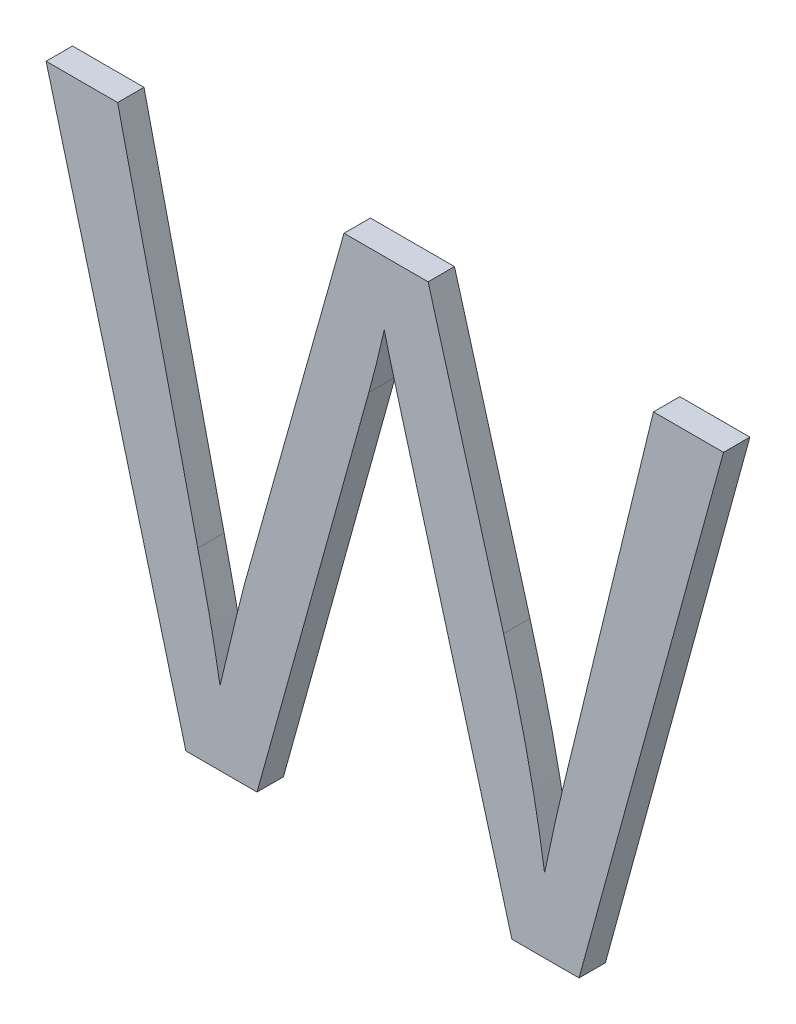
ISO-10303-21;
HEADER;
FILE_DESCRIPTION(('STEP AP214'),'2;1');
FILE_NAME('part.step','',(''),(''),'','','');
FILE_SCHEMA(('AUTOMOTIVE_DESIGN { 1 0 10303 214 1 1 1 1 }'));
ENDSEC;
DATA;
#1=APPLICATION_CONTEXT('core data for automotive mechanical design processes');
#2=APPLICATION_PROTOCOL_DEFINITION('international standard','automotive_design',2000,#1);
#3=PRODUCT_CONTEXT('',#1,'mechanical');
#4=PRODUCT('Part','Part','',(#3));
#5=PRODUCT_RELATED_PRODUCT_CATEGORY('part','',(#4));
#6=PRODUCT_DEFINITION_FORMATION('','',#4);
#7=PRODUCT_DEFINITION_CONTEXT('part definition',#1,'design');
#8=PRODUCT_DEFINITION('design','',#6,#7);
#9=PRODUCT_DEFINITION_SHAPE('','',#8);
#10=(LENGTH_UNIT() NAMED_UNIT(*) SI_UNIT(.MILLI.,.METRE.));
#11=(NAMED_UNIT(*) PLANE_ANGLE_UNIT() SI_UNIT($,.RADIAN.));
#12=(NAMED_UNIT(*) SI_UNIT($,.STERADIAN.) SOLID_ANGLE_UNIT());
#13=UNCERTAINTY_MEASURE_WITH_UNIT(LENGTH_MEASURE(1.E-05),#10,'distance_accuracy_value','');
#14=(GEOMETRIC_REPRESENTATION_CONTEXT(3) GLOBAL_UNCERTAINTY_ASSIGNED_CONTEXT((#13)) GLOBAL_UNIT_ASSIGNED_CONTEXT((#10,
#11,#12)) REPRESENTATION_CONTEXT('',''));
#15=CARTESIAN_POINT('',(0.,0.,0.));
#16=DIRECTION('',(0.,0.,1.));
#17=DIRECTION('',(1.,0.,0.));
#18=AXIS2_PLACEMENT_3D('',#15,#16,#17);
#19=CARTESIAN_POINT('',(3.803658458647,0.527411851963,0.05));
#20=DIRECTION('',(0.,0.,1.));
#21=DIRECTION('',(1.,0.,0.));
#22=AXIS2_PLACEMENT_3D('',#19,#20,#21);
#23=PLANE('',#22);
#24=DIRECTION('',(-0.256189417113928,0.966626599343731,0.));
#25=VECTOR('',#24,1.);
#26=CARTESIAN_POINT('',(3.427507267442,0.,0.05));
#27=LINE('',#26,#25);
#28=CARTESIAN_POINT('',(3.427507267442,0.,0.05));
#29=VERTEX_POINT('',#28);
#30=CARTESIAN_POINT('',(3.162472747093,1.,0.05));
#31=VERTEX_POINT('',#30);
#32=EDGE_CURVE('E251',#29,#31,#27,.T.);
#33=ORIENTED_EDGE('',*,*,#32,.F.);
#34=DIRECTION('',(-1.,0.,0.));
#35=VECTOR('',#34,1.);
#36=CARTESIAN_POINT('',(3.562409156977,0.,0.05));
#37=LINE('',#36,#35);
#38=CARTESIAN_POINT('',(3.562409156977,0.,0.05));
#39=VERTEX_POINT('',#38);
#40=EDGE_CURVE('E133',#39,#29,#37,.T.);
#41=ORIENTED_EDGE('',*,*,#40,.F.);
#42=DIRECTION('',(-0.267880789475975,-0.963452065558909,0.));
#43=VECTOR('',#42,1.);
#44=CARTESIAN_POINT('',(3.774300508721,0.762082122093,0.05));
#45=LINE('',#44,#43);
#46=CARTESIAN_POINT('',(3.774300508721,0.762082122093,0.05));
#47=VERTEX_POINT('',#46);
#48=EDGE_CURVE('E201',#47,#39,#45,.T.);
#49=ORIENTED_EDGE('',*,*,#48,.F.);
#50=CARTESIAN_POINT('',(3.803597383721,0.879405886628,0.05));
#51=CARTESIAN_POINT('',(3.787926962209,0.810501453488,0.05));
#52=CARTESIAN_POINT('',(3.774300508721,0.762082122093,0.05));
#53=(BOUNDED_CURVE() B_SPLINE_CURVE(2,(#50,#51,#52),.UNSPECIFIED.,.F.,
.F.) B_SPLINE_CURVE_WITH_KNOTS((3,3),(0.,1.),
.UNSPECIFIED.) CURVE() GEOMETRIC_REPRESENTATION_ITEM() RATIONAL_B_SPLINE_CURVE((1.,1.,1.)) REPRESENTATION_ITEM(''));
#54=CARTESIAN_POINT('',(3.803597383721,0.879405886628,0.05));
#55=VERTEX_POINT('',#54);
#56=EDGE_CURVE('E188',#55,#47,#53,.T.);
#57=ORIENTED_EDGE('',*,*,#56,.F.);
#58=CARTESIAN_POINT('',(3.834938226744,0.762082122093,0.05));
#59=CARTESIAN_POINT('',(3.808366642442,0.857558139535,0.05));
#60=CARTESIAN_POINT('',(3.803597383721,0.879405886628,0.05));
#61=(BOUNDED_CURVE() B_SPLINE_CURVE(2,(#58,#59,#60),.UNSPECIFIED.,.F.,
.F.) B_SPLINE_CURVE_WITH_KNOTS((3,3),(0.,1.),
.UNSPECIFIED.) CURVE() GEOMETRIC_REPRESENTATION_ITEM() RATIONAL_B_SPLINE_CURVE((1.,1.,1.)) REPRESENTATION_ITEM(''));
#62=CARTESIAN_POINT('',(3.834938226744,0.762082122093,0.05));
#63=VERTEX_POINT('',#62);
#64=EDGE_CURVE('E230',#63,#55,#61,.T.);
#65=ORIENTED_EDGE('',*,*,#64,.F.);
#66=DIRECTION('',(-0.266280599628952,0.963895555680825,0.));
#67=VECTOR('',#66,1.);
#68=CARTESIAN_POINT('',(4.04546693314,0.,0.05));
#69=LINE('',#68,#67);
#70=CARTESIAN_POINT('',(4.04546693314,0.,0.05));
#71=VERTEX_POINT('',#70);
#72=EDGE_CURVE('E237',#71,#63,#69,.T.);
#73=ORIENTED_EDGE('',*,*,#72,.F.);
#74=DIRECTION('',(-1.,0.,0.));
#75=VECTOR('',#74,1.);
#76=CARTESIAN_POINT('',(4.172874273256,0.,0.05));
#77=LINE('',#76,#75);
#78=CARTESIAN_POINT('',(4.172874273256,0.,0.05));
#79=VERTEX_POINT('',#78);
#80=EDGE_CURVE('E252',#79,#71,#77,.T.);
#81=ORIENTED_EDGE('',*,*,#80,.F.);
#82=DIRECTION('',(-0.264162578961926,-0.96447816557773,0.));
#83=VECTOR('',#82,1.);
#84=CARTESIAN_POINT('',(4.446765988372,1.,0.05));
#85=LINE('',#84,#83);
#86=CARTESIAN_POINT('',(4.446765988372,1.,0.05));
#87=VERTEX_POINT('',#86);
#88=EDGE_CURVE('E341',#87,#79,#85,.T.);
#89=ORIENTED_EDGE('',*,*,#88,.F.);
#90=DIRECTION('',(1.,0.,0.));
#91=VECTOR('',#90,1.);
#92=CARTESIAN_POINT('',(4.31390806686,1.,0.05));
#93=LINE('',#92,#91);
#94=CARTESIAN_POINT('',(4.31390806686,1.,0.05));
#95=VERTEX_POINT('',#94);
#96=EDGE_CURVE('E333',#95,#87,#93,.T.);
#97=ORIENTED_EDGE('',*,*,#96,.F.);
#98=DIRECTION('',(0.236892951176044,0.971535758314178,0.));
#99=VECTOR('',#98,1.);
#100=CARTESIAN_POINT('',(4.157203851744,0.357331031977,0.05));
#101=LINE('',#100,#99);
#102=CARTESIAN_POINT('',(4.157203851744,0.357331031977,0.05));
#103=VERTEX_POINT('',#102);
#104=EDGE_CURVE('E222',#103,#95,#101,.T.);
#105=ORIENTED_EDGE('',*,*,#104,.F.);
#106=CARTESIAN_POINT('',(4.107467296512,0.139671148256,0.05));
#107=CARTESIAN_POINT('',(4.126544331395,0.234511264535,0.05));
#108=CARTESIAN_POINT('',(4.157203851744,0.357331031977,0.05));
#109=(BOUNDED_CURVE() B_SPLINE_CURVE(2,(#106,#107,#108),.UNSPECIFIED.,.F.,
.F.) B_SPLINE_CURVE_WITH_KNOTS((3,3),(0.,1.),
.UNSPECIFIED.) CURVE() GEOMETRIC_REPRESENTATION_ITEM() RATIONAL_B_SPLINE_CURVE((1.,1.,1.)) REPRESENTATION_ITEM(''));
#110=CARTESIAN_POINT('',(4.107467296512,0.139671148256,0.05));
#111=VERTEX_POINT('',#110);
#112=EDGE_CURVE('E349',#111,#103,#109,.T.);
#113=ORIENTED_EDGE('',*,*,#112,.F.);
#114=CARTESIAN_POINT('',(4.029796511628,0.493777252907,0.05));
#115=CARTESIAN_POINT('',(4.083621002907,0.305459665698,0.05));
#116=CARTESIAN_POINT('',(4.107467296512,0.139671148256,0.05));
#117=(BOUNDED_CURVE() B_SPLINE_CURVE(2,(#114,#115,#116),.UNSPECIFIED.,.F.,
.F.) B_SPLINE_CURVE_WITH_KNOTS((3,3),(0.,1.),
.UNSPECIFIED.) CURVE() GEOMETRIC_REPRESENTATION_ITEM() RATIONAL_B_SPLINE_CURVE((1.,1.,1.)) REPRESENTATION_ITEM(''));
#118=CARTESIAN_POINT('',(4.029796511628,0.493777252907,0.05));
#119=VERTEX_POINT('',#118);
#120=EDGE_CURVE('E301',#119,#111,#117,.T.);
#121=ORIENTED_EDGE('',*,*,#120,.F.);
#122=DIRECTION('',(0.271983078318987,-0.962302034242954,0.));
#123=VECTOR('',#122,1.);
#124=CARTESIAN_POINT('',(3.88671875,1.,0.05));
#125=LINE('',#124,#123);
#126=CARTESIAN_POINT('',(3.88671875,1.,0.05));
#127=VERTEX_POINT('',#126);
#128=EDGE_CURVE('E362',#127,#119,#125,.T.);
#129=ORIENTED_EDGE('',*,*,#128,.F.);
#130=DIRECTION('',(1.,0.,0.));
#131=VECTOR('',#130,1.);
#132=CARTESIAN_POINT('',(3.727289244186,1.,0.05));
#133=LINE('',#132,#131);
#134=CARTESIAN_POINT('',(3.727289244186,1.,0.05));
#135=VERTEX_POINT('',#134);
#136=EDGE_CURVE('E294',#135,#127,#133,.T.);
#137=ORIENTED_EDGE('',*,*,#136,.F.);
#138=DIRECTION('',(0.270914292797929,0.962603472857748,0.));
#139=VECTOR('',#138,1.);
#140=CARTESIAN_POINT('',(3.537200218023,0.324582122093,0.05));
#141=LINE('',#140,#139);
#142=CARTESIAN_POINT('',(3.537200218023,0.324582122093,0.05));
#143=VERTEX_POINT('',#142);
#144=EDGE_CURVE('E271',#143,#135,#141,.T.);
#145=ORIENTED_EDGE('',*,*,#144,.F.);
#146=CARTESIAN_POINT('',(3.492232921512,0.139671148256,0.05));
#147=CARTESIAN_POINT('',(3.530386991279,0.300009084302,0.05));
#148=CARTESIAN_POINT('',(3.537200218023,0.324582122093,0.05));
#149=(BOUNDED_CURVE() B_SPLINE_CURVE(2,(#146,#147,#148),.UNSPECIFIED.,.F.,
.F.) B_SPLINE_CURVE_WITH_KNOTS((3,3),(0.,1.),
.UNSPECIFIED.) CURVE() GEOMETRIC_REPRESENTATION_ITEM() RATIONAL_B_SPLINE_CURVE((1.,1.,1.)) REPRESENTATION_ITEM(''));
#150=CARTESIAN_POINT('',(3.492232921512,0.139671148256,0.05));
#151=VERTEX_POINT('',#150);
#152=EDGE_CURVE('E355',#151,#143,#149,.T.);
#153=ORIENTED_EDGE('',*,*,#152,.F.);
#154=CARTESIAN_POINT('',(3.449990915698,0.344340479651,0.05));
#155=CARTESIAN_POINT('',(3.474518531977,0.241324491279,0.05));
#156=CARTESIAN_POINT('',(3.492232921512,0.139671148256,0.05));
#157=(BOUNDED_CURVE() B_SPLINE_CURVE(2,(#154,#155,#156),.UNSPECIFIED.,.F.,
.F.) B_SPLINE_CURVE_WITH_KNOTS((3,3),(0.,1.),
.UNSPECIFIED.) CURVE() GEOMETRIC_REPRESENTATION_ITEM() RATIONAL_B_SPLINE_CURVE((1.,1.,1.)) REPRESENTATION_ITEM(''));
#158=CARTESIAN_POINT('',(3.449990915698,0.344340479651,0.05));
#159=VERTEX_POINT('',#158);
#160=EDGE_CURVE('E282',#159,#151,#157,.T.);
#161=ORIENTED_EDGE('',*,*,#160,.F.);
#162=DIRECTION('',(0.225746612348977,-0.9741860535919,0.));
#163=VECTOR('',#162,1.);
#164=CARTESIAN_POINT('',(3.298055959302,1.,0.05));
#165=LINE('',#164,#163);
#166=CARTESIAN_POINT('',(3.298055959302,1.,0.05));
#167=VERTEX_POINT('',#166);
#168=EDGE_CURVE('E153',#167,#159,#165,.T.);
#169=ORIENTED_EDGE('',*,*,#168,.F.);
#170=DIRECTION('',(1.,0.,0.));
#171=VECTOR('',#170,1.);
#172=CARTESIAN_POINT('',(3.162472747093,1.,0.05));
#173=LINE('',#172,#171);
#174=EDGE_CURVE('E29',#31,#167,#173,.T.);
#175=ORIENTED_EDGE('',*,*,#174,.F.);
#176=EDGE_LOOP('',(#33,#41,#49,#57,#65,#73,#81,#89,#97,#105,#113,#121,#129,#137,#145,#153,#161,
#169,#175));
#177=FACE_BOUND('',#176,.T.);
#178=ADVANCED_FACE('F17',(#177),#23,.T.);
#179=CARTESIAN_POINT('',(3.803658458647,0.527411851963,0.));
#180=DIRECTION('',(0.,0.,1.));
#181=DIRECTION('',(1.,0.,0.));
#182=AXIS2_PLACEMENT_3D('',#179,#180,#181);
#183=PLANE('',#182);
#184=DIRECTION('',(1.,0.,0.));
#185=VECTOR('',#184,1.);
#186=CARTESIAN_POINT('',(3.162472747093,1.,0.));
#187=LINE('',#186,#185);
#188=CARTESIAN_POINT('',(3.162472747093,1.,0.));
#189=VERTEX_POINT('',#188);
#190=CARTESIAN_POINT('',(3.298055959302,1.,0.));
#191=VERTEX_POINT('',#190);
#192=EDGE_CURVE('E11',#189,#191,#187,.T.);
#193=ORIENTED_EDGE('',*,*,#192,.T.);
#194=DIRECTION('',(0.225746612348977,-0.9741860535919,0.));
#195=VECTOR('',#194,1.);
#196=CARTESIAN_POINT('',(3.298055959302,1.,0.));
#197=LINE('',#196,#195);
#198=CARTESIAN_POINT('',(3.449990915698,0.344340479651,0.));
#199=VERTEX_POINT('',#198);
#200=EDGE_CURVE('E22',#191,#199,#197,.T.);
#201=ORIENTED_EDGE('',*,*,#200,.T.);
#202=CARTESIAN_POINT('',(3.449990915698,0.344340479651,0.));
#203=CARTESIAN_POINT('',(3.474518531977,0.241324491279,0.));
#204=CARTESIAN_POINT('',(3.492232921512,0.139671148256,0.));
#205=(BOUNDED_CURVE() B_SPLINE_CURVE(2,(#202,#203,#204),.UNSPECIFIED.,.F.,
.F.) B_SPLINE_CURVE_WITH_KNOTS((3,3),(0.,1.),
.UNSPECIFIED.) CURVE() GEOMETRIC_REPRESENTATION_ITEM() RATIONAL_B_SPLINE_CURVE((1.,1.,1.)) REPRESENTATION_ITEM(''));
#206=CARTESIAN_POINT('',(3.492232921512,0.139671148256,0.));
#207=VERTEX_POINT('',#206);
#208=EDGE_CURVE('E277',#199,#207,#205,.T.);
#209=ORIENTED_EDGE('',*,*,#208,.T.);
#210=CARTESIAN_POINT('',(3.492232921512,0.139671148256,0.));
#211=CARTESIAN_POINT('',(3.530386991279,0.300009084302,0.));
#212=CARTESIAN_POINT('',(3.537200218023,0.324582122093,0.));
#213=(BOUNDED_CURVE() B_SPLINE_CURVE(2,(#210,#211,#212),.UNSPECIFIED.,.F.,
.F.) B_SPLINE_CURVE_WITH_KNOTS((3,3),(0.,1.),
.UNSPECIFIED.) CURVE() GEOMETRIC_REPRESENTATION_ITEM() RATIONAL_B_SPLINE_CURVE((1.,1.,1.)) REPRESENTATION_ITEM(''));
#214=CARTESIAN_POINT('',(3.537200218023,0.324582122093,0.));
#215=VERTEX_POINT('',#214);
#216=EDGE_CURVE('E331',#207,#215,#213,.T.);
#217=ORIENTED_EDGE('',*,*,#216,.T.);
#218=DIRECTION('',(0.270914292797929,0.962603472857748,0.));
#219=VECTOR('',#218,1.);
#220=CARTESIAN_POINT('',(3.537200218023,0.324582122093,0.));
#221=LINE('',#220,#219);
#222=CARTESIAN_POINT('',(3.727289244186,1.,0.));
#223=VERTEX_POINT('',#222);
#224=EDGE_CURVE('E264',#215,#223,#221,.T.);
#225=ORIENTED_EDGE('',*,*,#224,.T.);
#226=DIRECTION('',(1.,0.,0.));
#227=VECTOR('',#226,1.);
#228=CARTESIAN_POINT('',(3.727289244186,1.,0.));
#229=LINE('',#228,#227);
#230=CARTESIAN_POINT('',(3.88671875,1.,0.));
#231=VERTEX_POINT('',#230);
#232=EDGE_CURVE('E276',#223,#231,#229,.T.);
#233=ORIENTED_EDGE('',*,*,#232,.T.);
#234=DIRECTION('',(0.271983078318987,-0.962302034242954,0.));
#235=VECTOR('',#234,1.);
#236=CARTESIAN_POINT('',(3.88671875,1.,0.));
#237=LINE('',#236,#235);
#238=CARTESIAN_POINT('',(4.029796511628,0.493777252907,0.));
#239=VERTEX_POINT('',#238);
#240=EDGE_CURVE('E356',#231,#239,#237,.T.);
#241=ORIENTED_EDGE('',*,*,#240,.T.);
#242=CARTESIAN_POINT('',(4.029796511628,0.493777252907,0.));
#243=CARTESIAN_POINT('',(4.083621002907,0.305459665698,0.));
#244=CARTESIAN_POINT('',(4.107467296512,0.139671148256,0.));
#245=(BOUNDED_CURVE() B_SPLINE_CURVE(2,(#242,#243,#244),.UNSPECIFIED.,.F.,
.F.) B_SPLINE_CURVE_WITH_KNOTS((3,3),(0.,1.),
.UNSPECIFIED.) CURVE() GEOMETRIC_REPRESENTATION_ITEM() RATIONAL_B_SPLINE_CURVE((1.,1.,1.)) REPRESENTATION_ITEM(''));
#246=CARTESIAN_POINT('',(4.107467296512,0.139671148256,0.));
#247=VERTEX_POINT('',#246);
#248=EDGE_CURVE('E307',#239,#247,#245,.T.);
#249=ORIENTED_EDGE('',*,*,#248,.T.);
#250=CARTESIAN_POINT('',(4.107467296512,0.139671148256,0.));
#251=CARTESIAN_POINT('',(4.126544331395,0.234511264535,0.));
#252=CARTESIAN_POINT('',(4.157203851744,0.357331031977,0.));
#253=(BOUNDED_CURVE() B_SPLINE_CURVE(2,(#250,#251,#252),.UNSPECIFIED.,.F.,
.F.) B_SPLINE_CURVE_WITH_KNOTS((3,3),(0.,1.),
.UNSPECIFIED.) CURVE() GEOMETRIC_REPRESENTATION_ITEM() RATIONAL_B_SPLINE_CURVE((1.,1.,1.)) REPRESENTATION_ITEM(''));
#254=CARTESIAN_POINT('',(4.157203851744,0.357331031977,0.));
#255=VERTEX_POINT('',#254);
#256=EDGE_CURVE('E378',#247,#255,#253,.T.);
#257=ORIENTED_EDGE('',*,*,#256,.T.);
#258=DIRECTION('',(0.236892951176044,0.971535758314178,0.));
#259=VECTOR('',#258,1.);
#260=CARTESIAN_POINT('',(4.157203851744,0.357331031977,0.));
#261=LINE('',#260,#259);
#262=CARTESIAN_POINT('',(4.31390806686,1.,0.));
#263=VERTEX_POINT('',#262);
#264=EDGE_CURVE('E238',#255,#263,#261,.T.);
#265=ORIENTED_EDGE('',*,*,#264,.T.);
#266=DIRECTION('',(1.,0.,0.));
#267=VECTOR('',#266,1.);
#268=CARTESIAN_POINT('',(4.31390806686,1.,0.));
#269=LINE('',#268,#267);
#270=CARTESIAN_POINT('',(4.446765988372,1.,0.));
#271=VERTEX_POINT('',#270);
#272=EDGE_CURVE('E223',#263,#271,#269,.T.);
#273=ORIENTED_EDGE('',*,*,#272,.T.);
#274=DIRECTION('',(-0.264162578961926,-0.96447816557773,0.));
#275=VECTOR('',#274,1.);
#276=CARTESIAN_POINT('',(4.446765988372,1.,0.));
#277=LINE('',#276,#275);
#278=CARTESIAN_POINT('',(4.172874273256,0.,0.));
#279=VERTEX_POINT('',#278);
#280=EDGE_CURVE('E337',#271,#279,#277,.T.);
#281=ORIENTED_EDGE('',*,*,#280,.T.);
#282=DIRECTION('',(-1.,0.,0.));
#283=VECTOR('',#282,1.);
#284=CARTESIAN_POINT('',(4.172874273256,0.,0.));
#285=LINE('',#284,#283);
#286=CARTESIAN_POINT('',(4.04546693314,0.,0.));
#287=VERTEX_POINT('',#286);
#288=EDGE_CURVE('E255',#279,#287,#285,.T.);
#289=ORIENTED_EDGE('',*,*,#288,.T.);
#290=DIRECTION('',(-0.266280599628952,0.963895555680825,0.));
#291=VECTOR('',#290,1.);
#292=CARTESIAN_POINT('',(4.04546693314,0.,0.));
#293=LINE('',#292,#291);
#294=CARTESIAN_POINT('',(3.834938226744,0.762082122093,0.));
#295=VERTEX_POINT('',#294);
#296=EDGE_CURVE('E243',#287,#295,#293,.T.);
#297=ORIENTED_EDGE('',*,*,#296,.T.);
#298=CARTESIAN_POINT('',(3.834938226744,0.762082122093,0.));
#299=CARTESIAN_POINT('',(3.808366642442,0.857558139535,0.));
#300=CARTESIAN_POINT('',(3.803597383721,0.879405886628,0.));
#301=(BOUNDED_CURVE() B_SPLINE_CURVE(2,(#298,#299,#300),.UNSPECIFIED.,.F.,
.F.) B_SPLINE_CURVE_WITH_KNOTS((3,3),(0.,1.),
.UNSPECIFIED.) CURVE() GEOMETRIC_REPRESENTATION_ITEM() RATIONAL_B_SPLINE_CURVE((1.,1.,1.)) REPRESENTATION_ITEM(''));
#302=CARTESIAN_POINT('',(3.803597383721,0.879405886628,0.));
#303=VERTEX_POINT('',#302);
#304=EDGE_CURVE('E224',#295,#303,#301,.T.);
#305=ORIENTED_EDGE('',*,*,#304,.T.);
#306=CARTESIAN_POINT('',(3.803597383721,0.879405886628,0.));
#307=CARTESIAN_POINT('',(3.787926962209,0.810501453488,0.));
#308=CARTESIAN_POINT('',(3.774300508721,0.762082122093,0.));
#309=(BOUNDED_CURVE() B_SPLINE_CURVE(2,(#306,#307,#308),.UNSPECIFIED.,.F.,
.F.) B_SPLINE_CURVE_WITH_KNOTS((3,3),(0.,1.),
.UNSPECIFIED.) CURVE() GEOMETRIC_REPRESENTATION_ITEM() RATIONAL_B_SPLINE_CURVE((1.,1.,1.)) REPRESENTATION_ITEM(''));
#310=CARTESIAN_POINT('',(3.774300508721,0.762082122093,0.));
#311=VERTEX_POINT('',#310);
#312=EDGE_CURVE('E198',#303,#311,#309,.T.);
#313=ORIENTED_EDGE('',*,*,#312,.T.);
#314=DIRECTION('',(-0.267880789475975,-0.963452065558909,0.));
#315=VECTOR('',#314,1.);
#316=CARTESIAN_POINT('',(3.774300508721,0.762082122093,0.));
#317=LINE('',#316,#315);
#318=CARTESIAN_POINT('',(3.562409156977,0.,0.));
#319=VERTEX_POINT('',#318);
#320=EDGE_CURVE('E205',#311,#319,#317,.T.);
#321=ORIENTED_EDGE('',*,*,#320,.T.);
#322=DIRECTION('',(-1.,0.,0.));
#323=VECTOR('',#322,1.);
#324=CARTESIAN_POINT('',(3.562409156977,0.,0.));
#325=LINE('',#324,#323);
#326=CARTESIAN_POINT('',(3.427507267442,0.,0.));
#327=VERTEX_POINT('',#326);
#328=EDGE_CURVE('E120',#319,#327,#325,.T.);
#329=ORIENTED_EDGE('',*,*,#328,.T.);
#330=DIRECTION('',(-0.256189417113928,0.966626599343731,0.));
#331=VECTOR('',#330,1.);
#332=CARTESIAN_POINT('',(3.427507267442,0.,0.));
#333=LINE('',#332,#331);
#334=EDGE_CURVE('E250',#327,#189,#333,.T.);
#335=ORIENTED_EDGE('',*,*,#334,.T.);
#336=EDGE_LOOP('',(#193,#201,#209,#217,#225,#233,#241,#249,#257,#265,#273,#281,#289,#297,#305,
#313,#321,#329,#335));
#337=FACE_BOUND('',#336,.T.);
#338=ADVANCED_FACE('F494',(#337),#183,.F.);
#339=CARTESIAN_POINT('',(3.162472747093,1.,0.));
#340=DIRECTION('',(0.,1.,0.));
#341=DIRECTION('',(1.,0.,0.));
#342=AXIS2_PLACEMENT_3D('',#339,#340,#341);
#343=PLANE('',#342);
#344=DIRECTION('',(0.,0.,1.));
#345=VECTOR('',#344,1.);
#346=CARTESIAN_POINT('',(3.162472747093,1.,0.));
#347=LINE('',#346,#345);
#348=EDGE_CURVE('E247',#189,#31,#347,.T.);
#349=ORIENTED_EDGE('',*,*,#348,.T.);
#350=ORIENTED_EDGE('',*,*,#174,.T.);
#351=DIRECTION('',(0.,0.,1.));
#352=VECTOR('',#351,1.);
#353=CARTESIAN_POINT('',(3.298055959302,1.,0.));
#354=LINE('',#353,#352);
#355=EDGE_CURVE('E281',#191,#167,#354,.T.);
#356=ORIENTED_EDGE('',*,*,#355,.F.);
#357=ORIENTED_EDGE('',*,*,#192,.F.);
#358=EDGE_LOOP('',(#349,#350,#356,#357));
#359=FACE_BOUND('',#358,.T.);
#360=ADVANCED_FACE('F499',(#359),#343,.T.);
#361=CARTESIAN_POINT('',(3.298055959302,1.,0.));
#362=DIRECTION('',(0.9741860535919,0.225746612348977,0.));
#363=DIRECTION('',(0.,0.,-1.));
#364=AXIS2_PLACEMENT_3D('',#361,#362,#363);
#365=PLANE('',#364);
#366=ORIENTED_EDGE('',*,*,#355,.T.);
#367=ORIENTED_EDGE('',*,*,#168,.T.);
#368=DIRECTION('',(0.,0.,1.));
#369=VECTOR('',#368,1.);
#370=CARTESIAN_POINT('',(3.449990915698,0.344340479651,0.));
#371=LINE('',#370,#369);
#372=EDGE_CURVE('E328',#199,#159,#371,.T.);
#373=ORIENTED_EDGE('',*,*,#372,.F.);
#374=ORIENTED_EDGE('',*,*,#200,.F.);
#375=EDGE_LOOP('',(#366,#367,#373,#374));
#376=FACE_BOUND('',#375,.T.);
#377=ADVANCED_FACE('F490',(#376),#365,.T.);
#378=CARTESIAN_POINT('',(3.449990915698,0.344340479651,0.));
#379=CARTESIAN_POINT('',(3.474518531977,0.241324491279,0.));
#380=CARTESIAN_POINT('',(3.492232921512,0.139671148256,0.));
#381=(BOUNDED_CURVE() B_SPLINE_CURVE(2,(#378,#379,#380),.UNSPECIFIED.,.F.,
.F.) B_SPLINE_CURVE_WITH_KNOTS((3,3),(0.,1.),
.UNSPECIFIED.) CURVE() GEOMETRIC_REPRESENTATION_ITEM() RATIONAL_B_SPLINE_CURVE((1.,1.,1.)) REPRESENTATION_ITEM(''));
#382=DIRECTION('',(0.,0.,-1.));
#383=VECTOR('',#382,1.);
#384=SURFACE_OF_LINEAR_EXTRUSION('',#381,#383);
#385=ORIENTED_EDGE('',*,*,#372,.T.);
#386=ORIENTED_EDGE('',*,*,#160,.T.);
#387=DIRECTION('',(0.,0.,1.));
#388=VECTOR('',#387,1.);
#389=CARTESIAN_POINT('',(3.492232921512,0.139671148256,0.));
#390=LINE('',#389,#388);
#391=EDGE_CURVE('E218',#207,#151,#390,.T.);
#392=ORIENTED_EDGE('',*,*,#391,.F.);
#393=ORIENTED_EDGE('',*,*,#208,.F.);
#394=EDGE_LOOP('',(#385,#386,#392,#393));
#395=FACE_BOUND('',#394,.T.);
#396=ADVANCED_FACE('F486',(#395),#384,.T.);
#397=CARTESIAN_POINT('',(3.492232921512,0.139671148256,0.));
#398=CARTESIAN_POINT('',(3.530386991279,0.300009084302,0.));
#399=CARTESIAN_POINT('',(3.537200218023,0.324582122093,0.));
#400=(BOUNDED_CURVE() B_SPLINE_CURVE(2,(#397,#398,#399),.UNSPECIFIED.,.F.,
.F.) B_SPLINE_CURVE_WITH_KNOTS((3,3),(0.,1.),
.UNSPECIFIED.) CURVE() GEOMETRIC_REPRESENTATION_ITEM() RATIONAL_B_SPLINE_CURVE((1.,1.,1.)) REPRESENTATION_ITEM(''));
#401=DIRECTION('',(0.,0.,-1.));
#402=VECTOR('',#401,1.);
#403=SURFACE_OF_LINEAR_EXTRUSION('',#400,#402);
#404=ORIENTED_EDGE('',*,*,#391,.T.);
#405=ORIENTED_EDGE('',*,*,#152,.T.);
#406=DIRECTION('',(0.,0.,1.));
#407=VECTOR('',#406,1.);
#408=CARTESIAN_POINT('',(3.537200218023,0.324582122093,0.));
#409=LINE('',#408,#407);
#410=EDGE_CURVE('E272',#215,#143,#409,.T.);
#411=ORIENTED_EDGE('',*,*,#410,.F.);
#412=ORIENTED_EDGE('',*,*,#216,.F.);
#413=EDGE_LOOP('',(#404,#405,#411,#412));
#414=FACE_BOUND('',#413,.T.);
#415=ADVANCED_FACE('F489',(#414),#403,.T.);
#416=CARTESIAN_POINT('',(3.537200218023,0.324582122093,0.));
#417=DIRECTION('',(-0.962603472857748,0.270914292797929,0.));
#418=DIRECTION('',(0.,0.,1.));
#419=AXIS2_PLACEMENT_3D('',#416,#417,#418);
#420=PLANE('',#419);
#421=ORIENTED_EDGE('',*,*,#410,.T.);
#422=ORIENTED_EDGE('',*,*,#144,.T.);
#423=DIRECTION('',(0.,0.,1.));
#424=VECTOR('',#423,1.);
#425=CARTESIAN_POINT('',(3.727289244186,1.,0.));
#426=LINE('',#425,#424);
#427=EDGE_CURVE('E325',#223,#135,#426,.T.);
#428=ORIENTED_EDGE('',*,*,#427,.F.);
#429=ORIENTED_EDGE('',*,*,#224,.F.);
#430=EDGE_LOOP('',(#421,#422,#428,#429));
#431=FACE_BOUND('',#430,.T.);
#432=ADVANCED_FACE('F525',(#431),#420,.T.);
#433=CARTESIAN_POINT('',(3.727289244186,1.,0.));
#434=DIRECTION('',(0.,1.,0.));
#435=DIRECTION('',(1.,0.,0.));
#436=AXIS2_PLACEMENT_3D('',#433,#434,#435);
#437=PLANE('',#436);
#438=ORIENTED_EDGE('',*,*,#427,.T.);
#439=ORIENTED_EDGE('',*,*,#136,.T.);
#440=DIRECTION('',(0.,0.,1.));
#441=VECTOR('',#440,1.);
#442=CARTESIAN_POINT('',(3.88671875,1.,0.));
#443=LINE('',#442,#441);
#444=EDGE_CURVE('E316',#231,#127,#443,.T.);
#445=ORIENTED_EDGE('',*,*,#444,.F.);
#446=ORIENTED_EDGE('',*,*,#232,.F.);
#447=EDGE_LOOP('',(#438,#439,#445,#446));
#448=FACE_BOUND('',#447,.T.);
#449=ADVANCED_FACE('F452',(#448),#437,.T.);
#450=CARTESIAN_POINT('',(3.88671875,1.,0.));
#451=DIRECTION('',(0.962302034242954,0.271983078318987,0.));
#452=DIRECTION('',(0.,0.,-1.));
#453=AXIS2_PLACEMENT_3D('',#450,#451,#452);
#454=PLANE('',#453);
#455=ORIENTED_EDGE('',*,*,#444,.T.);
#456=ORIENTED_EDGE('',*,*,#128,.T.);
#457=DIRECTION('',(0.,0.,1.));
#458=VECTOR('',#457,1.);
#459=CARTESIAN_POINT('',(4.029796511628,0.493777252907,0.));
#460=LINE('',#459,#458);
#461=EDGE_CURVE('E308',#239,#119,#460,.T.);
#462=ORIENTED_EDGE('',*,*,#461,.F.);
#463=ORIENTED_EDGE('',*,*,#240,.F.);
#464=EDGE_LOOP('',(#455,#456,#462,#463));
#465=FACE_BOUND('',#464,.T.);
#466=ADVANCED_FACE('F446',(#465),#454,.T.);
#467=CARTESIAN_POINT('',(4.029796511628,0.493777252907,0.));
#468=CARTESIAN_POINT('',(4.083621002907,0.305459665698,0.));
#469=CARTESIAN_POINT('',(4.107467296512,0.139671148256,0.));
#470=(BOUNDED_CURVE() B_SPLINE_CURVE(2,(#467,#468,#469),.UNSPECIFIED.,.F.,
.F.) B_SPLINE_CURVE_WITH_KNOTS((3,3),(0.,1.),
.UNSPECIFIED.) CURVE() GEOMETRIC_REPRESENTATION_ITEM() RATIONAL_B_SPLINE_CURVE((1.,1.,1.)) REPRESENTATION_ITEM(''));
#471=DIRECTION('',(0.,0.,-1.));
#472=VECTOR('',#471,1.);
#473=SURFACE_OF_LINEAR_EXTRUSION('',#470,#472);
#474=ORIENTED_EDGE('',*,*,#461,.T.);
#475=ORIENTED_EDGE('',*,*,#120,.T.);
#476=DIRECTION('',(0.,0.,1.));
#477=VECTOR('',#476,1.);
#478=CARTESIAN_POINT('',(4.107467296512,0.139671148256,0.));
#479=LINE('',#478,#477);
#480=EDGE_CURVE('E242',#247,#111,#479,.T.);
#481=ORIENTED_EDGE('',*,*,#480,.F.);
#482=ORIENTED_EDGE('',*,*,#248,.F.);
#483=EDGE_LOOP('',(#474,#475,#481,#482));
#484=FACE_BOUND('',#483,.T.);
#485=ADVANCED_FACE('F464',(#484),#473,.T.);
#486=CARTESIAN_POINT('',(4.107467296512,0.139671148256,0.));
#487=CARTESIAN_POINT('',(4.126544331395,0.234511264535,0.));
#488=CARTESIAN_POINT('',(4.157203851744,0.357331031977,0.));
#489=(BOUNDED_CURVE() B_SPLINE_CURVE(2,(#486,#487,#488),.UNSPECIFIED.,.F.,
.F.) B_SPLINE_CURVE_WITH_KNOTS((3,3),(0.,1.),
.UNSPECIFIED.) CURVE() GEOMETRIC_REPRESENTATION_ITEM() RATIONAL_B_SPLINE_CURVE((1.,1.,1.)) REPRESENTATION_ITEM(''));
#490=DIRECTION('',(0.,0.,-1.));
#491=VECTOR('',#490,1.);
#492=SURFACE_OF_LINEAR_EXTRUSION('',#489,#491);
#493=ORIENTED_EDGE('',*,*,#480,.T.);
#494=ORIENTED_EDGE('',*,*,#112,.T.);
#495=DIRECTION('',(0.,0.,1.));
#496=VECTOR('',#495,1.);
#497=CARTESIAN_POINT('',(4.157203851744,0.357331031977,0.));
#498=LINE('',#497,#496);
#499=EDGE_CURVE('E219',#255,#103,#498,.T.);
#500=ORIENTED_EDGE('',*,*,#499,.F.);
#501=ORIENTED_EDGE('',*,*,#256,.F.);
#502=EDGE_LOOP('',(#493,#494,#500,#501));
#503=FACE_BOUND('',#502,.T.);
#504=ADVANCED_FACE('F513',(#503),#492,.T.);
#505=CARTESIAN_POINT('',(4.157203851744,0.357331031977,0.));
#506=DIRECTION('',(-0.971535758314178,0.236892951176044,0.));
#507=DIRECTION('',(0.,0.,1.));
#508=AXIS2_PLACEMENT_3D('',#505,#506,#507);
#509=PLANE('',#508);
#510=ORIENTED_EDGE('',*,*,#499,.T.);
#511=ORIENTED_EDGE('',*,*,#104,.T.);
#512=DIRECTION('',(0.,0.,1.));
#513=VECTOR('',#512,1.);
#514=CARTESIAN_POINT('',(4.31390806686,1.,0.));
#515=LINE('',#514,#513);
#516=EDGE_CURVE('E336',#263,#95,#515,.T.);
#517=ORIENTED_EDGE('',*,*,#516,.F.);
#518=ORIENTED_EDGE('',*,*,#264,.F.);
#519=EDGE_LOOP('',(#510,#511,#517,#518));
#520=FACE_BOUND('',#519,.T.);
#521=ADVANCED_FACE('F518',(#520),#509,.T.);
#522=CARTESIAN_POINT('',(4.31390806686,1.,0.));
#523=DIRECTION('',(0.,1.,0.));
#524=DIRECTION('',(1.,0.,0.));
#525=AXIS2_PLACEMENT_3D('',#522,#523,#524);
#526=PLANE('',#525);
#527=ORIENTED_EDGE('',*,*,#516,.T.);
#528=ORIENTED_EDGE('',*,*,#96,.T.);
#529=DIRECTION('',(0.,0.,1.));
#530=VECTOR('',#529,1.);
#531=CARTESIAN_POINT('',(4.446765988372,1.,0.));
#532=LINE('',#531,#530);
#533=EDGE_CURVE('E258',#271,#87,#532,.T.);
#534=ORIENTED_EDGE('',*,*,#533,.F.);
#535=ORIENTED_EDGE('',*,*,#272,.F.);
#536=EDGE_LOOP('',(#527,#528,#534,#535));
#537=FACE_BOUND('',#536,.T.);
#538=ADVANCED_FACE('F533',(#537),#526,.T.);
#539=CARTESIAN_POINT('',(4.446765988372,1.,0.));
#540=DIRECTION('',(0.96447816557773,-0.264162578961926,0.));
#541=DIRECTION('',(0.,0.,-1.));
#542=AXIS2_PLACEMENT_3D('',#539,#540,#541);
#543=PLANE('',#542);
#544=ORIENTED_EDGE('',*,*,#533,.T.);
#545=ORIENTED_EDGE('',*,*,#88,.T.);
#546=DIRECTION('',(0.,0.,1.));
#547=VECTOR('',#546,1.);
#548=CARTESIAN_POINT('',(4.172874273256,0.,0.));
#549=LINE('',#548,#547);
#550=EDGE_CURVE('E246',#279,#79,#549,.T.);
#551=ORIENTED_EDGE('',*,*,#550,.F.);
#552=ORIENTED_EDGE('',*,*,#280,.F.);
#553=EDGE_LOOP('',(#544,#545,#551,#552));
#554=FACE_BOUND('',#553,.T.);
#555=ADVANCED_FACE('F510',(#554),#543,.T.);
#556=CARTESIAN_POINT('',(4.172874273256,0.,0.));
#557=DIRECTION('',(0.,-1.,0.));
#558=DIRECTION('',(0.,0.,-1.));
#559=AXIS2_PLACEMENT_3D('',#556,#557,#558);
#560=PLANE('',#559);
#561=ORIENTED_EDGE('',*,*,#550,.T.);
#562=ORIENTED_EDGE('',*,*,#80,.T.);
#563=DIRECTION('',(0.,0.,1.));
#564=VECTOR('',#563,1.);
#565=CARTESIAN_POINT('',(4.04546693314,0.,0.));
#566=LINE('',#565,#564);
#567=EDGE_CURVE('E229',#287,#71,#566,.T.);
#568=ORIENTED_EDGE('',*,*,#567,.F.);
#569=ORIENTED_EDGE('',*,*,#288,.F.);
#570=EDGE_LOOP('',(#561,#562,#568,#569));
#571=FACE_BOUND('',#570,.T.);
#572=ADVANCED_FACE('F507',(#571),#560,.T.);
#573=CARTESIAN_POINT('',(4.04546693314,0.,0.));
#574=DIRECTION('',(-0.963895555680825,-0.266280599628952,0.));
#575=DIRECTION('',(-0.266280599628952,0.963895555680825,0.));
#576=AXIS2_PLACEMENT_3D('',#573,#574,#575);
#577=PLANE('',#576);
#578=ORIENTED_EDGE('',*,*,#567,.T.);
#579=ORIENTED_EDGE('',*,*,#72,.T.);
#580=DIRECTION('',(0.,0.,1.));
#581=VECTOR('',#580,1.);
#582=CARTESIAN_POINT('',(3.834938226744,0.762082122093,0.));
#583=LINE('',#582,#581);
#584=EDGE_CURVE('E263',#295,#63,#583,.T.);
#585=ORIENTED_EDGE('',*,*,#584,.F.);
#586=ORIENTED_EDGE('',*,*,#296,.F.);
#587=EDGE_LOOP('',(#578,#579,#585,#586));
#588=FACE_BOUND('',#587,.T.);
#589=ADVANCED_FACE('F509',(#588),#577,.T.);
#590=CARTESIAN_POINT('',(3.834938226744,0.762082122093,0.));
#591=CARTESIAN_POINT('',(3.808366642442,0.857558139535,0.));
#592=CARTESIAN_POINT('',(3.803597383721,0.879405886628,0.));
#593=(BOUNDED_CURVE() B_SPLINE_CURVE(2,(#590,#591,#592),.UNSPECIFIED.,.F.,
.F.) B_SPLINE_CURVE_WITH_KNOTS((3,3),(0.,1.),
.UNSPECIFIED.) CURVE() GEOMETRIC_REPRESENTATION_ITEM() RATIONAL_B_SPLINE_CURVE((1.,1.,1.)) REPRESENTATION_ITEM(''));
#594=DIRECTION('',(0.,0.,-1.));
#595=VECTOR('',#594,1.);
#596=SURFACE_OF_LINEAR_EXTRUSION('',#593,#595);
#597=ORIENTED_EDGE('',*,*,#584,.T.);
#598=ORIENTED_EDGE('',*,*,#64,.T.);
#599=DIRECTION('',(0.,0.,1.));
#600=VECTOR('',#599,1.);
#601=CARTESIAN_POINT('',(3.803597383721,0.879405886628,0.));
#602=LINE('',#601,#600);
#603=EDGE_CURVE('E194',#303,#55,#602,.T.);
#604=ORIENTED_EDGE('',*,*,#603,.F.);
#605=ORIENTED_EDGE('',*,*,#304,.F.);
#606=EDGE_LOOP('',(#597,#598,#604,#605));
#607=FACE_BOUND('',#606,.T.);
#608=ADVANCED_FACE('F537',(#607),#596,.T.);
#609=CARTESIAN_POINT('',(3.803597383721,0.879405886628,0.));
#610=CARTESIAN_POINT('',(3.787926962209,0.810501453488,0.));
#611=CARTESIAN_POINT('',(3.774300508721,0.762082122093,0.));
#612=(BOUNDED_CURVE() B_SPLINE_CURVE(2,(#609,#610,#611),.UNSPECIFIED.,.F.,
.F.) B_SPLINE_CURVE_WITH_KNOTS((3,3),(0.,1.),
.UNSPECIFIED.) CURVE() GEOMETRIC_REPRESENTATION_ITEM() RATIONAL_B_SPLINE_CURVE((1.,1.,1.)) REPRESENTATION_ITEM(''));
#613=DIRECTION('',(0.,0.,-1.));
#614=VECTOR('',#613,1.);
#615=SURFACE_OF_LINEAR_EXTRUSION('',#612,#614);
#616=ORIENTED_EDGE('',*,*,#603,.T.);
#617=ORIENTED_EDGE('',*,*,#56,.T.);
#618=DIRECTION('',(0.,0.,1.));
#619=VECTOR('',#618,1.);
#620=CARTESIAN_POINT('',(3.774300508721,0.762082122093,0.));
#621=LINE('',#620,#619);
#622=EDGE_CURVE('E192',#311,#47,#621,.T.);
#623=ORIENTED_EDGE('',*,*,#622,.F.);
#624=ORIENTED_EDGE('',*,*,#312,.F.);
#625=EDGE_LOOP('',(#616,#617,#623,#624));
#626=FACE_BOUND('',#625,.T.);
#627=ADVANCED_FACE('F19',(#626),#615,.T.);
#628=CARTESIAN_POINT('',(3.774300508721,0.762082122093,0.));
#629=DIRECTION('',(0.963452065558909,-0.267880789475975,0.));
#630=DIRECTION('',(0.,0.,-1.));
#631=AXIS2_PLACEMENT_3D('',#628,#629,#630);
#632=PLANE('',#631);
#633=ORIENTED_EDGE('',*,*,#622,.T.);
#634=ORIENTED_EDGE('',*,*,#48,.T.);
#635=DIRECTION('',(0.,0.,1.));
#636=VECTOR('',#635,1.);
#637=CARTESIAN_POINT('',(3.562409156977,0.,0.));
#638=LINE('',#637,#636);
#639=EDGE_CURVE('E365',#319,#39,#638,.T.);
#640=ORIENTED_EDGE('',*,*,#639,.F.);
#641=ORIENTED_EDGE('',*,*,#320,.F.);
#642=EDGE_LOOP('',(#633,#634,#640,#641));
#643=FACE_BOUND('',#642,.T.);
#644=ADVANCED_FACE('F208',(#643),#632,.T.);
#645=CARTESIAN_POINT('',(3.562409156977,0.,0.));
#646=DIRECTION('',(0.,-1.,0.));
#647=DIRECTION('',(0.,0.,-1.));
#648=AXIS2_PLACEMENT_3D('',#645,#646,#647);
#649=PLANE('',#648);
#650=ORIENTED_EDGE('',*,*,#639,.T.);
#651=ORIENTED_EDGE('',*,*,#40,.T.);
#652=DIRECTION('',(0.,0.,1.));
#653=VECTOR('',#652,1.);
#654=CARTESIAN_POINT('',(3.427507267442,0.,0.));
#655=LINE('',#654,#653);
#656=EDGE_CURVE('E400',#327,#29,#655,.T.);
#657=ORIENTED_EDGE('',*,*,#656,.F.);
#658=ORIENTED_EDGE('',*,*,#328,.F.);
#659=EDGE_LOOP('',(#650,#651,#657,#658));
#660=FACE_BOUND('',#659,.T.);
#661=ADVANCED_FACE('F530',(#660),#649,.T.);
#662=CARTESIAN_POINT('',(3.427507267442,0.,0.));
#663=DIRECTION('',(-0.966626599343731,-0.256189417113928,0.));
#664=DIRECTION('',(-0.256189417113928,0.966626599343731,0.));
#665=AXIS2_PLACEMENT_3D('',#662,#663,#664);
#666=PLANE('',#665);
#667=ORIENTED_EDGE('',*,*,#656,.T.);
#668=ORIENTED_EDGE('',*,*,#32,.T.);
#669=ORIENTED_EDGE('',*,*,#348,.F.);
#670=ORIENTED_EDGE('',*,*,#334,.F.);
#671=EDGE_LOOP('',(#667,#668,#669,#670));
#672=FACE_BOUND('',#671,.T.);
#673=ADVANCED_FACE('F527',(#672),#666,.T.);
#674=CLOSED_SHELL('',(#178,#338,#360,#377,#396,#415,#432,#449,#466,#485,#504,#521,#538,#555,
#572,#589,#608,#627,#644,#661,#673));
#675=MANIFOLD_SOLID_BREP('B1',#674);
#676=ADVANCED_BREP_SHAPE_REPRESENTATION('',(#18,#675),#14);
#677=SHAPE_DEFINITION_REPRESENTATION(#9,#676);
ENDSEC;
END-ISO-10303-21;
